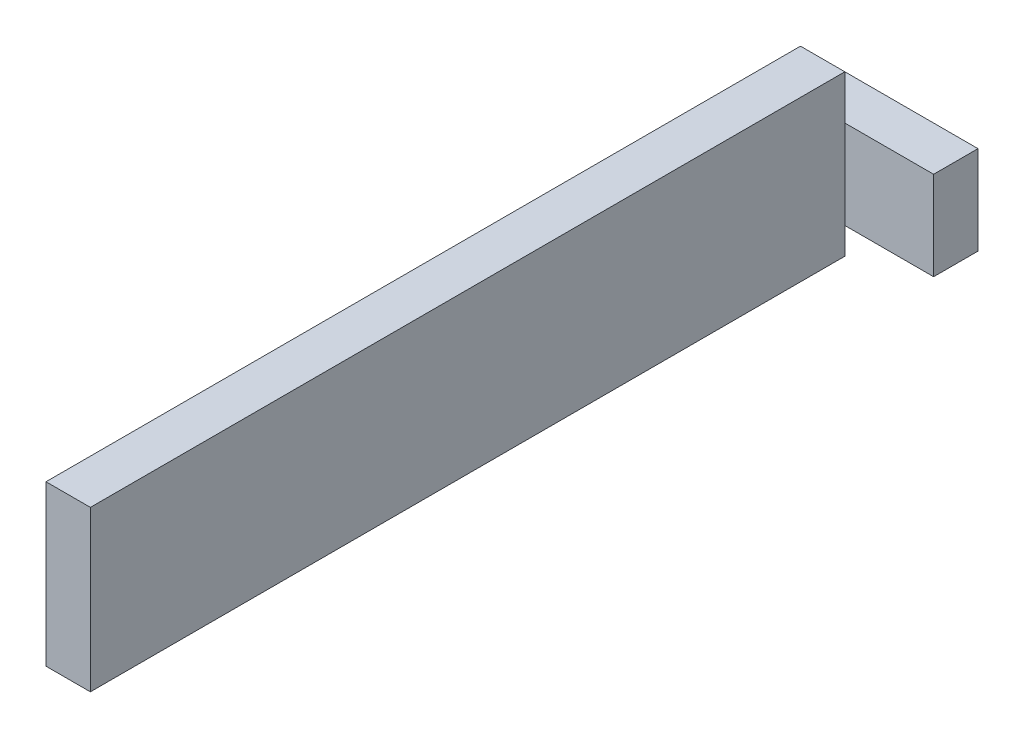
ISO-10303-21;
HEADER;
FILE_DESCRIPTION(('STEP AP214'),'2;1');
FILE_NAME('part.step','',(''),(''),'','','');
FILE_SCHEMA(('AUTOMOTIVE_DESIGN { 1 0 10303 214 1 1 1 1 }'));
ENDSEC;
DATA;
#1=APPLICATION_CONTEXT('core data for automotive mechanical design processes');
#2=APPLICATION_PROTOCOL_DEFINITION('international standard','automotive_design',2000,#1);
#3=PRODUCT_CONTEXT('',#1,'mechanical');
#4=PRODUCT('Part','Part','',(#3));
#5=PRODUCT_RELATED_PRODUCT_CATEGORY('part','',(#4));
#6=PRODUCT_DEFINITION_FORMATION('','',#4);
#7=PRODUCT_DEFINITION_CONTEXT('part definition',#1,'design');
#8=PRODUCT_DEFINITION('design','',#6,#7);
#9=PRODUCT_DEFINITION_SHAPE('','',#8);
#10=(LENGTH_UNIT() NAMED_UNIT(*) SI_UNIT(.MILLI.,.METRE.));
#11=(NAMED_UNIT(*) PLANE_ANGLE_UNIT() SI_UNIT($,.RADIAN.));
#12=(NAMED_UNIT(*) SI_UNIT($,.STERADIAN.) SOLID_ANGLE_UNIT());
#13=UNCERTAINTY_MEASURE_WITH_UNIT(LENGTH_MEASURE(1.E-05),#10,'distance_accuracy_value','');
#14=(GEOMETRIC_REPRESENTATION_CONTEXT(3) GLOBAL_UNCERTAINTY_ASSIGNED_CONTEXT((#13)) GLOBAL_UNIT_ASSIGNED_CONTEXT((#10,
#11,#12)) REPRESENTATION_CONTEXT('',''));
#15=CARTESIAN_POINT('',(0.,0.,0.));
#16=DIRECTION('',(0.,0.,1.));
#17=DIRECTION('',(1.,0.,0.));
#18=AXIS2_PLACEMENT_3D('',#15,#16,#17);
#19=CARTESIAN_POINT('',(0.,0.,0.));
#20=DIRECTION('',(0.,1.,0.));
#21=DIRECTION('',(0.,0.,1.));
#22=AXIS2_PLACEMENT_3D('',#19,#20,#21);
#23=PLANE('',#22);
#24=DIRECTION('',(1.,0.,0.));
#25=VECTOR('',#24,1.);
#26=CARTESIAN_POINT('',(-4.99999999999999,0.,4.99999999999999));
#27=LINE('',#26,#25);
#28=CARTESIAN_POINT('',(-10.,0.,4.99999999999999));
#29=VERTEX_POINT('',#28);
#30=CARTESIAN_POINT('',(-4.99999999999999,0.,4.99999999999999));
#31=VERTEX_POINT('',#30);
#32=EDGE_CURVE('E49',#29,#31,#27,.T.);
#33=ORIENTED_EDGE('',*,*,#32,.F.);
#34=DIRECTION('',(0.,0.,1.));
#35=VECTOR('',#34,1.);
#36=CARTESIAN_POINT('',(-10.,0.,0.));
#37=LINE('',#36,#35);
#38=CARTESIAN_POINT('',(-10.,0.,0.));
#39=VERTEX_POINT('',#38);
#40=EDGE_CURVE('E173',#39,#29,#37,.T.);
#41=ORIENTED_EDGE('',*,*,#40,.F.);
#42=DIRECTION('',(-1.,0.,0.));
#43=VECTOR('',#42,1.);
#44=CARTESIAN_POINT('',(0.,0.,0.));
#45=LINE('',#44,#43);
#46=CARTESIAN_POINT('',(5.00000000000001,0.,0.));
#47=VERTEX_POINT('',#46);
#48=EDGE_CURVE('E74',#47,#39,#45,.T.);
#49=ORIENTED_EDGE('',*,*,#48,.F.);
#50=DIRECTION('',(0.,0.,-1.));
#51=VECTOR('',#50,1.);
#52=CARTESIAN_POINT('',(5.00000000000001,0.,4.99999999999999));
#53=LINE('',#52,#51);
#54=CARTESIAN_POINT('',(5.00000000000001,0.,4.99999999999999));
#55=VERTEX_POINT('',#54);
#56=EDGE_CURVE('E166',#55,#47,#53,.T.);
#57=ORIENTED_EDGE('',*,*,#56,.F.);
#58=DIRECTION('',(1.,0.,0.));
#59=VECTOR('',#58,1.);
#60=CARTESIAN_POINT('',(0.,0.,4.99999999999999));
#61=LINE('',#60,#59);
#62=EDGE_CURVE('E175',#31,#55,#61,.T.);
#63=ORIENTED_EDGE('',*,*,#62,.F.);
#64=EDGE_LOOP('',(#33,#41,#49,#57,#63));
#65=FACE_BOUND('',#64,.T.);
#66=ADVANCED_FACE('F34',(#65),#23,.F.);
#67=CARTESIAN_POINT('',(0.,10.,0.));
#68=DIRECTION('',(0.,0.,1.));
#69=DIRECTION('',(1.,0.,0.));
#70=AXIS2_PLACEMENT_3D('',#67,#68,#69);
#71=PLANE('',#70);
#72=ORIENTED_EDGE('',*,*,#48,.T.);
#73=DIRECTION('',(0.,-1.,0.));
#74=VECTOR('',#73,1.);
#75=CARTESIAN_POINT('',(-10.,10.,0.));
#76=LINE('',#75,#74);
#77=CARTESIAN_POINT('',(-10.,10.,0.));
#78=VERTEX_POINT('',#77);
#79=EDGE_CURVE('E11',#78,#39,#76,.T.);
#80=ORIENTED_EDGE('',*,*,#79,.F.);
#81=DIRECTION('',(-1.,0.,0.));
#82=VECTOR('',#81,1.);
#83=CARTESIAN_POINT('',(0.,10.,0.));
#84=LINE('',#83,#82);
#85=CARTESIAN_POINT('',(5.00000000000001,10.,0.));
#86=VERTEX_POINT('',#85);
#87=EDGE_CURVE('E79',#86,#78,#84,.T.);
#88=ORIENTED_EDGE('',*,*,#87,.F.);
#89=DIRECTION('',(0.,-1.,0.));
#90=VECTOR('',#89,1.);
#91=CARTESIAN_POINT('',(5.00000000000001,10.,0.));
#92=LINE('',#91,#90);
#93=EDGE_CURVE('E171',#86,#47,#92,.T.);
#94=ORIENTED_EDGE('',*,*,#93,.T.);
#95=EDGE_LOOP('',(#72,#80,#88,#94));
#96=FACE_BOUND('',#95,.T.);
#97=ADVANCED_FACE('F36',(#96),#71,.F.);
#98=CARTESIAN_POINT('',(-10.,10.,0.));
#99=DIRECTION('',(1.,0.,0.));
#100=DIRECTION('',(0.,0.,-1.));
#101=AXIS2_PLACEMENT_3D('',#98,#99,#100);
#102=PLANE('',#101);
#103=ORIENTED_EDGE('',*,*,#40,.T.);
#104=DIRECTION('',(0.,1.,0.));
#105=VECTOR('',#104,1.);
#106=CARTESIAN_POINT('',(-9.99999999999999,-3.,4.99999999999999));
#107=LINE('',#106,#105);
#108=CARTESIAN_POINT('',(-9.99999999999999,-3.,4.99999999999999));
#109=VERTEX_POINT('',#108);
#110=EDGE_CURVE('E144',#109,#29,#107,.T.);
#111=ORIENTED_EDGE('',*,*,#110,.F.);
#112=DIRECTION('',(0.,0.,-1.));
#113=VECTOR('',#112,1.);
#114=CARTESIAN_POINT('',(-9.99999999999999,-3.,4.99999999999999));
#115=LINE('',#114,#113);
#116=CARTESIAN_POINT('',(-9.99999999999999,-3.,90.));
#117=VERTEX_POINT('',#116);
#118=EDGE_CURVE('E131',#117,#109,#115,.T.);
#119=ORIENTED_EDGE('',*,*,#118,.F.);
#120=DIRECTION('',(0.,-1.,0.));
#121=VECTOR('',#120,1.);
#122=CARTESIAN_POINT('',(-9.99999999999999,10.,90.));
#123=LINE('',#122,#121);
#124=CARTESIAN_POINT('',(-9.99999999999999,15.,90.));
#125=VERTEX_POINT('',#124);
#126=EDGE_CURVE('E42',#125,#117,#123,.T.);
#127=ORIENTED_EDGE('',*,*,#126,.F.);
#128=DIRECTION('',(0.,0.,1.));
#129=VECTOR('',#128,1.);
#130=CARTESIAN_POINT('',(-9.99999999999999,15.,90.));
#131=LINE('',#130,#129);
#132=CARTESIAN_POINT('',(-9.99999999999999,15.,4.99999999999999));
#133=VERTEX_POINT('',#132);
#134=EDGE_CURVE('E148',#133,#125,#131,.T.);
#135=ORIENTED_EDGE('',*,*,#134,.F.);
#136=DIRECTION('',(0.,-1.,0.));
#137=VECTOR('',#136,1.);
#138=CARTESIAN_POINT('',(-9.99999999999999,15.,4.99999999999999));
#139=LINE('',#138,#137);
#140=CARTESIAN_POINT('',(-9.99999999999999,10.,4.99999999999999));
#141=VERTEX_POINT('',#140);
#142=EDGE_CURVE('E156',#133,#141,#139,.T.);
#143=ORIENTED_EDGE('',*,*,#142,.T.);
#144=DIRECTION('',(0.,0.,1.));
#145=VECTOR('',#144,1.);
#146=CARTESIAN_POINT('',(-10.,10.,0.));
#147=LINE('',#146,#145);
#148=EDGE_CURVE('E165',#78,#141,#147,.T.);
#149=ORIENTED_EDGE('',*,*,#148,.F.);
#150=ORIENTED_EDGE('',*,*,#79,.T.);
#151=EDGE_LOOP('',(#103,#111,#119,#127,#135,#143,#149,#150));
#152=FACE_BOUND('',#151,.T.);
#153=ADVANCED_FACE('F192',(#152),#102,.F.);
#154=CARTESIAN_POINT('',(-9.99999999999999,10.,90.));
#155=DIRECTION('',(0.,0.,-1.));
#156=DIRECTION('',(-1.,0.,0.));
#157=AXIS2_PLACEMENT_3D('',#154,#155,#156);
#158=PLANE('',#157);
#159=ORIENTED_EDGE('',*,*,#126,.T.);
#160=DIRECTION('',(-1.,0.,0.));
#161=VECTOR('',#160,1.);
#162=CARTESIAN_POINT('',(-4.99999999999999,-3.,90.));
#163=LINE('',#162,#161);
#164=CARTESIAN_POINT('',(-4.99999999999999,-3.,90.));
#165=VERTEX_POINT('',#164);
#166=EDGE_CURVE('E127',#165,#117,#163,.T.);
#167=ORIENTED_EDGE('',*,*,#166,.F.);
#168=DIRECTION('',(0.,-1.,0.));
#169=VECTOR('',#168,1.);
#170=CARTESIAN_POINT('',(-4.99999999999999,10.,90.));
#171=LINE('',#170,#169);
#172=CARTESIAN_POINT('',(-4.99999999999999,15.,90.));
#173=VERTEX_POINT('',#172);
#174=EDGE_CURVE('E113',#173,#165,#171,.T.);
#175=ORIENTED_EDGE('',*,*,#174,.F.);
#176=DIRECTION('',(1.,0.,0.));
#177=VECTOR('',#176,1.);
#178=CARTESIAN_POINT('',(-9.99999999999999,15.,90.));
#179=LINE('',#178,#177);
#180=EDGE_CURVE('E151',#125,#173,#179,.T.);
#181=ORIENTED_EDGE('',*,*,#180,.F.);
#182=EDGE_LOOP('',(#159,#167,#175,#181));
#183=FACE_BOUND('',#182,.T.);
#184=ADVANCED_FACE('F128',(#183),#158,.F.);
#185=CARTESIAN_POINT('',(-4.99999999999999,10.,90.));
#186=DIRECTION('',(-1.,0.,0.));
#187=DIRECTION('',(0.,0.,1.));
#188=AXIS2_PLACEMENT_3D('',#185,#186,#187);
#189=PLANE('',#188);
#190=ORIENTED_EDGE('',*,*,#174,.T.);
#191=DIRECTION('',(0.,0.,1.));
#192=VECTOR('',#191,1.);
#193=CARTESIAN_POINT('',(-4.99999999999999,-3.,4.99999999999999));
#194=LINE('',#193,#192);
#195=CARTESIAN_POINT('',(-4.99999999999999,-3.,4.99999999999999));
#196=VERTEX_POINT('',#195);
#197=EDGE_CURVE('E118',#196,#165,#194,.T.);
#198=ORIENTED_EDGE('',*,*,#197,.F.);
#199=DIRECTION('',(0.,1.,0.));
#200=VECTOR('',#199,1.);
#201=CARTESIAN_POINT('',(-4.99999999999999,-3.,4.99999999999999));
#202=LINE('',#201,#200);
#203=EDGE_CURVE('E141',#196,#31,#202,.T.);
#204=ORIENTED_EDGE('',*,*,#203,.T.);
#205=DIRECTION('',(0.,-1.,0.));
#206=VECTOR('',#205,1.);
#207=CARTESIAN_POINT('',(-4.99999999999999,10.,4.99999999999999));
#208=LINE('',#207,#206);
#209=CARTESIAN_POINT('',(-4.99999999999999,10.,4.99999999999999));
#210=VERTEX_POINT('',#209);
#211=EDGE_CURVE('E124',#210,#31,#208,.T.);
#212=ORIENTED_EDGE('',*,*,#211,.F.);
#213=DIRECTION('',(0.,-1.,0.));
#214=VECTOR('',#213,1.);
#215=CARTESIAN_POINT('',(-4.99999999999999,15.,4.99999999999999));
#216=LINE('',#215,#214);
#217=CARTESIAN_POINT('',(-4.99999999999999,15.,4.99999999999999));
#218=VERTEX_POINT('',#217);
#219=EDGE_CURVE('E161',#218,#210,#216,.T.);
#220=ORIENTED_EDGE('',*,*,#219,.F.);
#221=DIRECTION('',(0.,0.,-1.));
#222=VECTOR('',#221,1.);
#223=CARTESIAN_POINT('',(-4.99999999999999,15.,90.));
#224=LINE('',#223,#222);
#225=EDGE_CURVE('E120',#173,#218,#224,.T.);
#226=ORIENTED_EDGE('',*,*,#225,.F.);
#227=EDGE_LOOP('',(#190,#198,#204,#212,#220,#226));
#228=FACE_BOUND('',#227,.T.);
#229=ADVANCED_FACE('F115',(#228),#189,.F.);
#230=CARTESIAN_POINT('',(0.,10.,4.99999999999999));
#231=DIRECTION('',(0.,0.,-1.));
#232=DIRECTION('',(-1.,0.,0.));
#233=AXIS2_PLACEMENT_3D('',#230,#231,#232);
#234=PLANE('',#233);
#235=ORIENTED_EDGE('',*,*,#62,.T.);
#236=DIRECTION('',(0.,-1.,0.));
#237=VECTOR('',#236,1.);
#238=CARTESIAN_POINT('',(5.00000000000001,10.,4.99999999999999));
#239=LINE('',#238,#237);
#240=CARTESIAN_POINT('',(5.00000000000001,10.,4.99999999999999));
#241=VERTEX_POINT('',#240);
#242=EDGE_CURVE('E180',#241,#55,#239,.T.);
#243=ORIENTED_EDGE('',*,*,#242,.F.);
#244=DIRECTION('',(1.,0.,0.));
#245=VECTOR('',#244,1.);
#246=CARTESIAN_POINT('',(-4.99999999999999,10.,4.99999999999999));
#247=LINE('',#246,#245);
#248=EDGE_CURVE('E168',#210,#241,#247,.T.);
#249=ORIENTED_EDGE('',*,*,#248,.F.);
#250=ORIENTED_EDGE('',*,*,#211,.T.);
#251=EDGE_LOOP('',(#235,#243,#249,#250));
#252=FACE_BOUND('',#251,.T.);
#253=ADVANCED_FACE('F186',(#252),#234,.F.);
#254=CARTESIAN_POINT('',(5.00000000000001,10.,4.99999999999999));
#255=DIRECTION('',(-1.,0.,0.));
#256=DIRECTION('',(0.,0.,1.));
#257=AXIS2_PLACEMENT_3D('',#254,#255,#256);
#258=PLANE('',#257);
#259=ORIENTED_EDGE('',*,*,#56,.T.);
#260=ORIENTED_EDGE('',*,*,#93,.F.);
#261=DIRECTION('',(0.,0.,-1.));
#262=VECTOR('',#261,1.);
#263=CARTESIAN_POINT('',(5.00000000000001,10.,4.99999999999999));
#264=LINE('',#263,#262);
#265=EDGE_CURVE('E58',#241,#86,#264,.T.);
#266=ORIENTED_EDGE('',*,*,#265,.F.);
#267=ORIENTED_EDGE('',*,*,#242,.T.);
#268=EDGE_LOOP('',(#259,#260,#266,#267));
#269=FACE_BOUND('',#268,.T.);
#270=ADVANCED_FACE('F196',(#269),#258,.F.);
#271=CARTESIAN_POINT('',(0.,10.,0.));
#272=DIRECTION('',(0.,1.,0.));
#273=DIRECTION('',(0.,0.,1.));
#274=AXIS2_PLACEMENT_3D('',#271,#272,#273);
#275=PLANE('',#274);
#276=DIRECTION('',(-1.,0.,0.));
#277=VECTOR('',#276,1.);
#278=CARTESIAN_POINT('',(-9.99999999999999,10.,4.99999999999999));
#279=LINE('',#278,#277);
#280=EDGE_CURVE('E147',#210,#141,#279,.T.);
#281=ORIENTED_EDGE('',*,*,#280,.F.);
#282=ORIENTED_EDGE('',*,*,#248,.T.);
#283=ORIENTED_EDGE('',*,*,#265,.T.);
#284=ORIENTED_EDGE('',*,*,#87,.T.);
#285=ORIENTED_EDGE('',*,*,#148,.T.);
#286=EDGE_LOOP('',(#281,#282,#283,#284,#285));
#287=FACE_BOUND('',#286,.T.);
#288=ADVANCED_FACE('F198',(#287),#275,.T.);
#289=CARTESIAN_POINT('',(-9.99999999999999,15.,4.99999999999999));
#290=DIRECTION('',(0.,0.,1.));
#291=DIRECTION('',(1.,0.,0.));
#292=AXIS2_PLACEMENT_3D('',#289,#290,#291);
#293=PLANE('',#292);
#294=ORIENTED_EDGE('',*,*,#280,.T.);
#295=ORIENTED_EDGE('',*,*,#142,.F.);
#296=DIRECTION('',(-1.,0.,0.));
#297=VECTOR('',#296,1.);
#298=CARTESIAN_POINT('',(-9.99999999999999,15.,4.99999999999999));
#299=LINE('',#298,#297);
#300=EDGE_CURVE('E154',#218,#133,#299,.T.);
#301=ORIENTED_EDGE('',*,*,#300,.F.);
#302=ORIENTED_EDGE('',*,*,#219,.T.);
#303=EDGE_LOOP('',(#294,#295,#301,#302));
#304=FACE_BOUND('',#303,.T.);
#305=ADVANCED_FACE('F204',(#304),#293,.F.);
#306=CARTESIAN_POINT('',(0.,15.,0.));
#307=DIRECTION('',(0.,-1.,0.));
#308=DIRECTION('',(0.,0.,-1.));
#309=AXIS2_PLACEMENT_3D('',#306,#307,#308);
#310=PLANE('',#309);
#311=ORIENTED_EDGE('',*,*,#134,.T.);
#312=ORIENTED_EDGE('',*,*,#180,.T.);
#313=ORIENTED_EDGE('',*,*,#225,.T.);
#314=ORIENTED_EDGE('',*,*,#300,.T.);
#315=EDGE_LOOP('',(#311,#312,#313,#314));
#316=FACE_BOUND('',#315,.T.);
#317=ADVANCED_FACE('F215',(#316),#310,.F.);
#318=CARTESIAN_POINT('',(-4.99999999999999,-3.,4.99999999999999));
#319=DIRECTION('',(0.,0.,1.));
#320=DIRECTION('',(1.,0.,0.));
#321=AXIS2_PLACEMENT_3D('',#318,#319,#320);
#322=PLANE('',#321);
#323=ORIENTED_EDGE('',*,*,#32,.T.);
#324=ORIENTED_EDGE('',*,*,#203,.F.);
#325=DIRECTION('',(1.,0.,0.));
#326=VECTOR('',#325,1.);
#327=CARTESIAN_POINT('',(-4.99999999999999,-3.,4.99999999999999));
#328=LINE('',#327,#326);
#329=EDGE_CURVE('E135',#109,#196,#328,.T.);
#330=ORIENTED_EDGE('',*,*,#329,.F.);
#331=ORIENTED_EDGE('',*,*,#110,.T.);
#332=EDGE_LOOP('',(#323,#324,#330,#331));
#333=FACE_BOUND('',#332,.T.);
#334=ADVANCED_FACE('F189',(#333),#322,.F.);
#335=CARTESIAN_POINT('',(0.,-3.,0.));
#336=DIRECTION('',(0.,-1.,0.));
#337=DIRECTION('',(0.,0.,-1.));
#338=AXIS2_PLACEMENT_3D('',#335,#336,#337);
#339=PLANE('',#338);
#340=ORIENTED_EDGE('',*,*,#197,.T.);
#341=ORIENTED_EDGE('',*,*,#166,.T.);
#342=ORIENTED_EDGE('',*,*,#118,.T.);
#343=ORIENTED_EDGE('',*,*,#329,.T.);
#344=EDGE_LOOP('',(#340,#341,#342,#343));
#345=FACE_BOUND('',#344,.T.);
#346=ADVANCED_FACE('F133',(#345),#339,.T.);
#347=CLOSED_SHELL('',(#66,#97,#153,#184,#229,#253,#270,#288,#305,#317,#334,#346));
#348=MANIFOLD_SOLID_BREP('B2',#347);
#349=ADVANCED_BREP_SHAPE_REPRESENTATION('',(#18,#348),#14);
#350=SHAPE_DEFINITION_REPRESENTATION(#9,#349);
ENDSEC;
END-ISO-10303-21;
